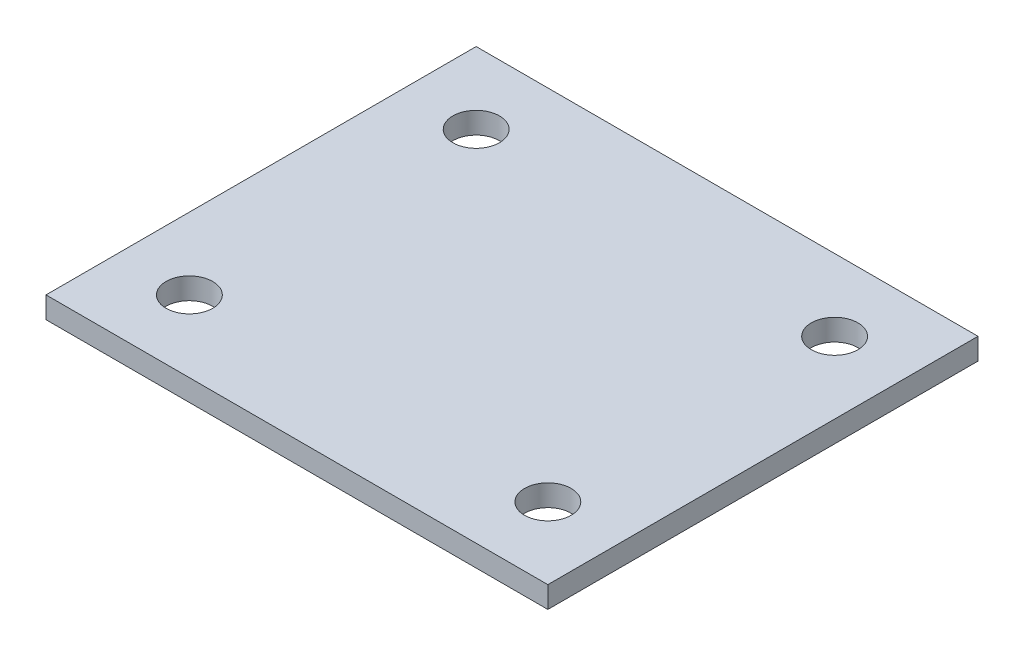
ISO-10303-21;
HEADER;
FILE_DESCRIPTION(('STEP AP214'),'2;1');
FILE_NAME('part.step','',(''),(''),'','','');
FILE_SCHEMA(('AUTOMOTIVE_DESIGN { 1 0 10303 214 1 1 1 1 }'));
ENDSEC;
DATA;
#1=APPLICATION_CONTEXT('core data for automotive mechanical design processes');
#2=APPLICATION_PROTOCOL_DEFINITION('international standard','automotive_design',2000,#1);
#3=PRODUCT_CONTEXT('',#1,'mechanical');
#4=PRODUCT('Part','Part','',(#3));
#5=PRODUCT_RELATED_PRODUCT_CATEGORY('part','',(#4));
#6=PRODUCT_DEFINITION_FORMATION('','',#4);
#7=PRODUCT_DEFINITION_CONTEXT('part definition',#1,'design');
#8=PRODUCT_DEFINITION('design','',#6,#7);
#9=PRODUCT_DEFINITION_SHAPE('','',#8);
#10=(LENGTH_UNIT() NAMED_UNIT(*) SI_UNIT(.MILLI.,.METRE.));
#11=(NAMED_UNIT(*) PLANE_ANGLE_UNIT() SI_UNIT($,.RADIAN.));
#12=(NAMED_UNIT(*) SI_UNIT($,.STERADIAN.) SOLID_ANGLE_UNIT());
#13=UNCERTAINTY_MEASURE_WITH_UNIT(LENGTH_MEASURE(1.E-05),#10,'distance_accuracy_value','');
#14=(GEOMETRIC_REPRESENTATION_CONTEXT(3) GLOBAL_UNCERTAINTY_ASSIGNED_CONTEXT((#13)) GLOBAL_UNIT_ASSIGNED_CONTEXT((#10,
#11,#12)) REPRESENTATION_CONTEXT('',''));
#15=CARTESIAN_POINT('',(0.,0.,0.));
#16=DIRECTION('',(0.,0.,1.));
#17=DIRECTION('',(1.,0.,0.));
#18=AXIS2_PLACEMENT_3D('',#15,#16,#17);
#19=CARTESIAN_POINT('',(0.,3.,0.));
#20=DIRECTION('',(0.,-1.,0.));
#21=DIRECTION('',(0.,0.,-1.));
#22=AXIS2_PLACEMENT_3D('',#19,#20,#21);
#23=PLANE('',#22);
#24=DIRECTION('',(0.,0.,1.));
#25=VECTOR('',#24,1.);
#26=CARTESIAN_POINT('',(0.,3.,0.));
#27=LINE('',#26,#25);
#28=CARTESIAN_POINT('',(0.,3.,-60.));
#29=VERTEX_POINT('',#28);
#30=CARTESIAN_POINT('',(0.,3.,0.));
#31=VERTEX_POINT('',#30);
#32=EDGE_CURVE('E92',#29,#31,#27,.T.);
#33=ORIENTED_EDGE('',*,*,#32,.T.);
#34=DIRECTION('',(1.,0.,0.));
#35=VECTOR('',#34,1.);
#36=CARTESIAN_POINT('',(0.,3.,0.));
#37=LINE('',#36,#35);
#38=CARTESIAN_POINT('',(70.,3.,0.));
#39=VERTEX_POINT('',#38);
#40=EDGE_CURVE('E87',#31,#39,#37,.T.);
#41=ORIENTED_EDGE('',*,*,#40,.T.);
#42=DIRECTION('',(0.,0.,-1.));
#43=VECTOR('',#42,1.);
#44=CARTESIAN_POINT('',(70.,3.,0.));
#45=LINE('',#44,#43);
#46=CARTESIAN_POINT('',(70.,3.,-60.));
#47=VERTEX_POINT('',#46);
#48=EDGE_CURVE('E90',#39,#47,#45,.T.);
#49=ORIENTED_EDGE('',*,*,#48,.T.);
#50=DIRECTION('',(-1.,0.,0.));
#51=VECTOR('',#50,1.);
#52=CARTESIAN_POINT('',(0.,3.,-60.));
#53=LINE('',#52,#51);
#54=EDGE_CURVE('E57',#47,#29,#53,.T.);
#55=ORIENTED_EDGE('',*,*,#54,.T.);
#56=EDGE_LOOP('',(#33,#41,#49,#55));
#57=FACE_BOUND('',#56,.T.);
#58=CARTESIAN_POINT('',(10.,3.,-10.));
#59=DIRECTION('',(0.,1.,0.));
#60=DIRECTION('',(0.,0.,1.));
#61=AXIS2_PLACEMENT_3D('',#58,#59,#60);
#62=CIRCLE('',#61,3.25);
#63=CARTESIAN_POINT('',(10.,3.,-6.75));
#64=VERTEX_POINT('',#63);
#65=EDGE_CURVE('E112',#64,#64,#62,.T.);
#66=ORIENTED_EDGE('',*,*,#65,.F.);
#67=EDGE_LOOP('',(#66));
#68=FACE_BOUND('',#67,.T.);
#69=CARTESIAN_POINT('',(60.,3.,-10.));
#70=DIRECTION('',(0.,1.,0.));
#71=DIRECTION('',(0.,0.,1.));
#72=AXIS2_PLACEMENT_3D('',#69,#70,#71);
#73=CIRCLE('',#72,3.25);
#74=CARTESIAN_POINT('',(60.,3.,-6.75));
#75=VERTEX_POINT('',#74);
#76=EDGE_CURVE('E134',#75,#75,#73,.T.);
#77=ORIENTED_EDGE('',*,*,#76,.F.);
#78=EDGE_LOOP('',(#77));
#79=FACE_BOUND('',#78,.T.);
#80=CARTESIAN_POINT('',(60.,3.,-50.));
#81=DIRECTION('',(0.,1.,0.));
#82=DIRECTION('',(0.,0.,1.));
#83=AXIS2_PLACEMENT_3D('',#80,#81,#82);
#84=CIRCLE('',#83,3.25000000000001);
#85=CARTESIAN_POINT('',(60.,3.,-46.75));
#86=VERTEX_POINT('',#85);
#87=EDGE_CURVE('E142',#86,#86,#84,.T.);
#88=ORIENTED_EDGE('',*,*,#87,.F.);
#89=EDGE_LOOP('',(#88));
#90=FACE_BOUND('',#89,.T.);
#91=CARTESIAN_POINT('',(10.,3.,-50.));
#92=DIRECTION('',(0.,1.,0.));
#93=DIRECTION('',(0.,0.,1.));
#94=AXIS2_PLACEMENT_3D('',#91,#92,#93);
#95=CIRCLE('',#94,3.25);
#96=CARTESIAN_POINT('',(10.,3.,-46.75));
#97=VERTEX_POINT('',#96);
#98=EDGE_CURVE('E150',#97,#97,#95,.T.);
#99=ORIENTED_EDGE('',*,*,#98,.F.);
#100=EDGE_LOOP('',(#99));
#101=FACE_BOUND('',#100,.T.);
#102=ADVANCED_FACE('F39',(#57,#68,#79,#90,#101),#23,.F.);
#103=CARTESIAN_POINT('',(0.,0.,0.));
#104=DIRECTION('',(0.,-1.,0.));
#105=DIRECTION('',(0.,0.,-1.));
#106=AXIS2_PLACEMENT_3D('',#103,#104,#105);
#107=PLANE('',#106);
#108=CARTESIAN_POINT('',(60.,0.,-50.));
#109=DIRECTION('',(0.,1.,0.));
#110=DIRECTION('',(0.,0.,1.));
#111=AXIS2_PLACEMENT_3D('',#108,#109,#110);
#112=CIRCLE('',#111,3.25000000000001);
#113=CARTESIAN_POINT('',(60.,0.,-46.75));
#114=VERTEX_POINT('',#113);
#115=EDGE_CURVE('E146',#114,#114,#112,.T.);
#116=ORIENTED_EDGE('',*,*,#115,.T.);
#117=EDGE_LOOP('',(#116));
#118=FACE_BOUND('',#117,.T.);
#119=CARTESIAN_POINT('',(10.,0.,-10.));
#120=DIRECTION('',(0.,1.,0.));
#121=DIRECTION('',(0.,0.,1.));
#122=AXIS2_PLACEMENT_3D('',#119,#120,#121);
#123=CIRCLE('',#122,3.25);
#124=CARTESIAN_POINT('',(10.,0.,-6.75));
#125=VERTEX_POINT('',#124);
#126=EDGE_CURVE('E130',#125,#125,#123,.T.);
#127=ORIENTED_EDGE('',*,*,#126,.T.);
#128=EDGE_LOOP('',(#127));
#129=FACE_BOUND('',#128,.T.);
#130=DIRECTION('',(0.,0.,1.));
#131=VECTOR('',#130,1.);
#132=CARTESIAN_POINT('',(0.,0.,0.));
#133=LINE('',#132,#131);
#134=CARTESIAN_POINT('',(0.,0.,-60.));
#135=VERTEX_POINT('',#134);
#136=CARTESIAN_POINT('',(0.,0.,0.));
#137=VERTEX_POINT('',#136);
#138=EDGE_CURVE('E108',#135,#137,#133,.T.);
#139=ORIENTED_EDGE('',*,*,#138,.F.);
#140=DIRECTION('',(-1.,0.,0.));
#141=VECTOR('',#140,1.);
#142=CARTESIAN_POINT('',(0.,0.,-60.));
#143=LINE('',#142,#141);
#144=CARTESIAN_POINT('',(70.,0.,-60.));
#145=VERTEX_POINT('',#144);
#146=EDGE_CURVE('E80',#145,#135,#143,.T.);
#147=ORIENTED_EDGE('',*,*,#146,.F.);
#148=DIRECTION('',(0.,0.,-1.));
#149=VECTOR('',#148,1.);
#150=CARTESIAN_POINT('',(70.,0.,0.));
#151=LINE('',#150,#149);
#152=CARTESIAN_POINT('',(70.,0.,0.));
#153=VERTEX_POINT('',#152);
#154=EDGE_CURVE('E74',#153,#145,#151,.T.);
#155=ORIENTED_EDGE('',*,*,#154,.F.);
#156=DIRECTION('',(1.,0.,0.));
#157=VECTOR('',#156,1.);
#158=CARTESIAN_POINT('',(0.,0.,0.));
#159=LINE('',#158,#157);
#160=EDGE_CURVE('E97',#137,#153,#159,.T.);
#161=ORIENTED_EDGE('',*,*,#160,.F.);
#162=EDGE_LOOP('',(#139,#147,#155,#161));
#163=FACE_BOUND('',#162,.T.);
#164=CARTESIAN_POINT('',(60.,0.,-10.));
#165=DIRECTION('',(0.,1.,0.));
#166=DIRECTION('',(0.,0.,1.));
#167=AXIS2_PLACEMENT_3D('',#164,#165,#166);
#168=CIRCLE('',#167,3.25);
#169=CARTESIAN_POINT('',(60.,0.,-6.75));
#170=VERTEX_POINT('',#169);
#171=EDGE_CURVE('E138',#170,#170,#168,.T.);
#172=ORIENTED_EDGE('',*,*,#171,.T.);
#173=EDGE_LOOP('',(#172));
#174=FACE_BOUND('',#173,.T.);
#175=CARTESIAN_POINT('',(10.,0.,-50.));
#176=DIRECTION('',(0.,1.,0.));
#177=DIRECTION('',(0.,0.,1.));
#178=AXIS2_PLACEMENT_3D('',#175,#176,#177);
#179=CIRCLE('',#178,3.25);
#180=CARTESIAN_POINT('',(10.,0.,-46.75));
#181=VERTEX_POINT('',#180);
#182=EDGE_CURVE('E154',#181,#181,#179,.T.);
#183=ORIENTED_EDGE('',*,*,#182,.T.);
#184=EDGE_LOOP('',(#183));
#185=FACE_BOUND('',#184,.T.);
#186=ADVANCED_FACE('F125',(#118,#129,#163,#174,#185),#107,.T.);
#187=CARTESIAN_POINT('',(0.,3.,0.));
#188=DIRECTION('',(1.,0.,0.));
#189=DIRECTION('',(0.,0.,-1.));
#190=AXIS2_PLACEMENT_3D('',#187,#188,#189);
#191=PLANE('',#190);
#192=ORIENTED_EDGE('',*,*,#138,.T.);
#193=DIRECTION('',(0.,-1.,0.));
#194=VECTOR('',#193,1.);
#195=CARTESIAN_POINT('',(0.,3.,0.));
#196=LINE('',#195,#194);
#197=EDGE_CURVE('E11',#31,#137,#196,.T.);
#198=ORIENTED_EDGE('',*,*,#197,.F.);
#199=ORIENTED_EDGE('',*,*,#32,.F.);
#200=DIRECTION('',(0.,-1.,0.));
#201=VECTOR('',#200,1.);
#202=CARTESIAN_POINT('',(0.,3.,-60.));
#203=LINE('',#202,#201);
#204=EDGE_CURVE('E104',#29,#135,#203,.T.);
#205=ORIENTED_EDGE('',*,*,#204,.T.);
#206=EDGE_LOOP('',(#192,#198,#199,#205));
#207=FACE_BOUND('',#206,.T.);
#208=ADVANCED_FACE('F41',(#207),#191,.F.);
#209=CARTESIAN_POINT('',(0.,3.,0.));
#210=DIRECTION('',(0.,0.,-1.));
#211=DIRECTION('',(-1.,0.,0.));
#212=AXIS2_PLACEMENT_3D('',#209,#210,#211);
#213=PLANE('',#212);
#214=ORIENTED_EDGE('',*,*,#160,.T.);
#215=DIRECTION('',(0.,-1.,0.));
#216=VECTOR('',#215,1.);
#217=CARTESIAN_POINT('',(70.,3.,0.));
#218=LINE('',#217,#216);
#219=EDGE_CURVE('E49',#39,#153,#218,.T.);
#220=ORIENTED_EDGE('',*,*,#219,.F.);
#221=ORIENTED_EDGE('',*,*,#40,.F.);
#222=ORIENTED_EDGE('',*,*,#197,.T.);
#223=EDGE_LOOP('',(#214,#220,#221,#222));
#224=FACE_BOUND('',#223,.T.);
#225=ADVANCED_FACE('F96',(#224),#213,.F.);
#226=CARTESIAN_POINT('',(70.,3.,0.));
#227=DIRECTION('',(-1.,0.,0.));
#228=DIRECTION('',(0.,0.,1.));
#229=AXIS2_PLACEMENT_3D('',#226,#227,#228);
#230=PLANE('',#229);
#231=ORIENTED_EDGE('',*,*,#154,.T.);
#232=DIRECTION('',(0.,-1.,0.));
#233=VECTOR('',#232,1.);
#234=CARTESIAN_POINT('',(70.,3.,-60.));
#235=LINE('',#234,#233);
#236=EDGE_CURVE('E99',#47,#145,#235,.T.);
#237=ORIENTED_EDGE('',*,*,#236,.F.);
#238=ORIENTED_EDGE('',*,*,#48,.F.);
#239=ORIENTED_EDGE('',*,*,#219,.T.);
#240=EDGE_LOOP('',(#231,#237,#238,#239));
#241=FACE_BOUND('',#240,.T.);
#242=ADVANCED_FACE('F100',(#241),#230,.F.);
#243=CARTESIAN_POINT('',(0.,3.,-60.));
#244=DIRECTION('',(0.,0.,1.));
#245=DIRECTION('',(1.,0.,0.));
#246=AXIS2_PLACEMENT_3D('',#243,#244,#245);
#247=PLANE('',#246);
#248=ORIENTED_EDGE('',*,*,#146,.T.);
#249=ORIENTED_EDGE('',*,*,#204,.F.);
#250=ORIENTED_EDGE('',*,*,#54,.F.);
#251=ORIENTED_EDGE('',*,*,#236,.T.);
#252=EDGE_LOOP('',(#248,#249,#250,#251));
#253=FACE_BOUND('',#252,.T.);
#254=ADVANCED_FACE('F122',(#253),#247,.F.);
#255=CARTESIAN_POINT('',(10.,3.,-10.));
#256=DIRECTION('',(0.,-1.,0.));
#257=DIRECTION('',(0.,0.,-1.));
#258=AXIS2_PLACEMENT_3D('',#255,#256,#257);
#259=CYLINDRICAL_SURFACE('',#258,3.25);
#260=ORIENTED_EDGE('',*,*,#65,.T.);
#261=EDGE_LOOP('',(#260));
#262=FACE_BOUND('',#261,.T.);
#263=ORIENTED_EDGE('',*,*,#126,.F.);
#264=EDGE_LOOP('',(#263));
#265=FACE_BOUND('',#264,.T.);
#266=ADVANCED_FACE('F173',(#262,#265),#259,.F.);
#267=CARTESIAN_POINT('',(60.,3.,-10.));
#268=DIRECTION('',(0.,-1.,0.));
#269=DIRECTION('',(0.,0.,-1.));
#270=AXIS2_PLACEMENT_3D('',#267,#268,#269);
#271=CYLINDRICAL_SURFACE('',#270,3.25);
#272=ORIENTED_EDGE('',*,*,#76,.T.);
#273=EDGE_LOOP('',(#272));
#274=FACE_BOUND('',#273,.T.);
#275=ORIENTED_EDGE('',*,*,#171,.F.);
#276=EDGE_LOOP('',(#275));
#277=FACE_BOUND('',#276,.T.);
#278=ADVANCED_FACE('F219',(#274,#277),#271,.F.);
#279=CARTESIAN_POINT('',(60.,3.,-50.));
#280=DIRECTION('',(0.,-1.,0.));
#281=DIRECTION('',(0.,0.,-1.));
#282=AXIS2_PLACEMENT_3D('',#279,#280,#281);
#283=CYLINDRICAL_SURFACE('',#282,3.25000000000001);
#284=ORIENTED_EDGE('',*,*,#87,.T.);
#285=EDGE_LOOP('',(#284));
#286=FACE_BOUND('',#285,.T.);
#287=ORIENTED_EDGE('',*,*,#115,.F.);
#288=EDGE_LOOP('',(#287));
#289=FACE_BOUND('',#288,.T.);
#290=ADVANCED_FACE('F227',(#286,#289),#283,.F.);
#291=CARTESIAN_POINT('',(10.,3.,-50.));
#292=DIRECTION('',(0.,-1.,0.));
#293=DIRECTION('',(0.,0.,-1.));
#294=AXIS2_PLACEMENT_3D('',#291,#292,#293);
#295=CYLINDRICAL_SURFACE('',#294,3.25);
#296=ORIENTED_EDGE('',*,*,#98,.T.);
#297=EDGE_LOOP('',(#296));
#298=FACE_BOUND('',#297,.T.);
#299=ORIENTED_EDGE('',*,*,#182,.F.);
#300=EDGE_LOOP('',(#299));
#301=FACE_BOUND('',#300,.T.);
#302=ADVANCED_FACE('F162',(#298,#301),#295,.F.);
#303=CLOSED_SHELL('',(#102,#186,#208,#225,#242,#254,#266,#278,#290,#302));
#304=MANIFOLD_SOLID_BREP('B2',#303);
#305=ADVANCED_BREP_SHAPE_REPRESENTATION('',(#18,#304),#14);
#306=SHAPE_DEFINITION_REPRESENTATION(#9,#305);
ENDSEC;
END-ISO-10303-21;
